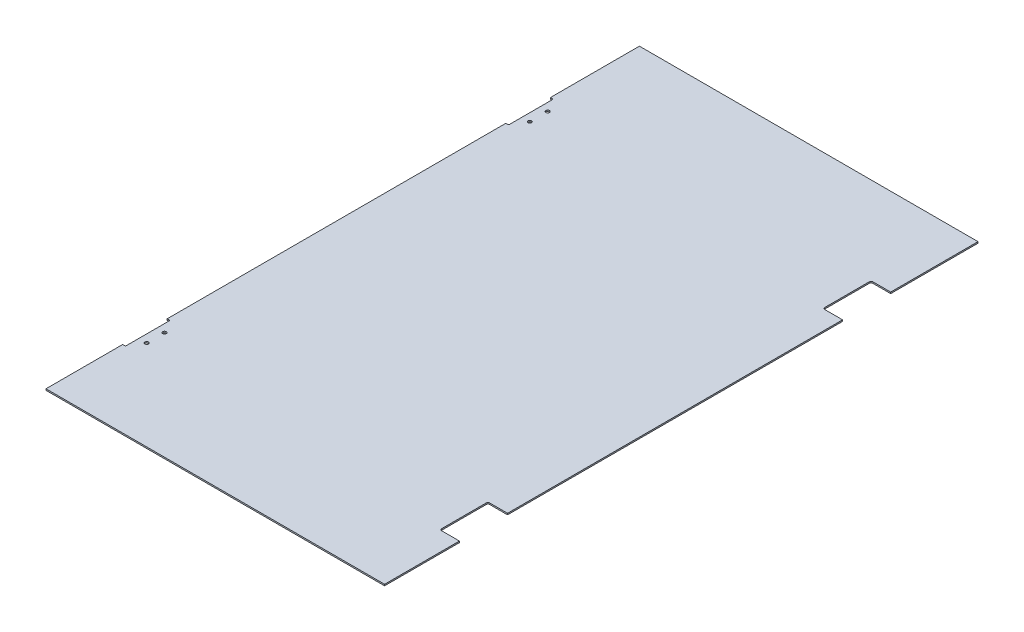
ISO-10303-21;
HEADER;
FILE_DESCRIPTION(('STEP AP214'),'2;1');
FILE_NAME('part.step','',(''),(''),'','','');
FILE_SCHEMA(('AUTOMOTIVE_DESIGN { 1 0 10303 214 1 1 1 1 }'));
ENDSEC;
DATA;
#1=APPLICATION_CONTEXT('core data for automotive mechanical design processes');
#2=APPLICATION_PROTOCOL_DEFINITION('international standard','automotive_design',2000,#1);
#3=PRODUCT_CONTEXT('',#1,'mechanical');
#4=PRODUCT('Part','Part','',(#3));
#5=PRODUCT_RELATED_PRODUCT_CATEGORY('part','',(#4));
#6=PRODUCT_DEFINITION_FORMATION('','',#4);
#7=PRODUCT_DEFINITION_CONTEXT('part definition',#1,'design');
#8=PRODUCT_DEFINITION('design','',#6,#7);
#9=PRODUCT_DEFINITION_SHAPE('','',#8);
#10=(LENGTH_UNIT() NAMED_UNIT(*) SI_UNIT(.MILLI.,.METRE.));
#11=(NAMED_UNIT(*) PLANE_ANGLE_UNIT() SI_UNIT($,.RADIAN.));
#12=(NAMED_UNIT(*) SI_UNIT($,.STERADIAN.) SOLID_ANGLE_UNIT());
#13=UNCERTAINTY_MEASURE_WITH_UNIT(LENGTH_MEASURE(1.E-05),#10,'distance_accuracy_value','');
#14=(GEOMETRIC_REPRESENTATION_CONTEXT(3) GLOBAL_UNCERTAINTY_ASSIGNED_CONTEXT((#13)) GLOBAL_UNIT_ASSIGNED_CONTEXT((#10,
#11,#12)) REPRESENTATION_CONTEXT('',''));
#15=CARTESIAN_POINT('',(0.,0.,0.));
#16=DIRECTION('',(0.,0.,1.));
#17=DIRECTION('',(1.,0.,0.));
#18=AXIS2_PLACEMENT_3D('',#15,#16,#17);
#19=CARTESIAN_POINT('',(95.3262518968133,0.79,-149.069802731411));
#20=DIRECTION('',(-1.,0.,0.));
#21=DIRECTION('',(0.,0.,1.));
#22=AXIS2_PLACEMENT_3D('',#19,#20,#21);
#23=PLANE('',#22);
#24=DIRECTION('',(0.,-1.,0.));
#25=VECTOR('',#24,1.);
#26=CARTESIAN_POINT('',(95.3262518968134,10.,114.930197268589));
#27=LINE('',#26,#25);
#28=CARTESIAN_POINT('',(95.3262518968134,0.790000000000001,114.930197268589));
#29=VERTEX_POINT('',#28);
#30=CARTESIAN_POINT('',(95.3262518968134,0.,114.930197268589));
#31=VERTEX_POINT('',#30);
#32=EDGE_CURVE('E251',#29,#31,#27,.T.);
#33=ORIENTED_EDGE('',*,*,#32,.T.);
#34=DIRECTION('',(0.,0.,-1.));
#35=VECTOR('',#34,1.);
#36=CARTESIAN_POINT('',(95.3262518968133,0.,-149.069802731411));
#37=LINE('',#36,#35);
#38=CARTESIAN_POINT('',(95.3262518968133,0.,-73.0698027314112));
#39=VERTEX_POINT('',#38);
#40=EDGE_CURVE('E439',#31,#39,#37,.T.);
#41=ORIENTED_EDGE('',*,*,#40,.T.);
#42=DIRECTION('',(0.,-1.,0.));
#43=VECTOR('',#42,1.);
#44=CARTESIAN_POINT('',(95.3262518968134,10.,-73.0698027314112));
#45=LINE('',#44,#43);
#46=CARTESIAN_POINT('',(95.3262518968134,0.790000000000001,-73.0698027314112));
#47=VERTEX_POINT('',#46);
#48=EDGE_CURVE('E339',#47,#39,#45,.T.);
#49=ORIENTED_EDGE('',*,*,#48,.F.);
#50=DIRECTION('',(0.,0.,-1.));
#51=VECTOR('',#50,1.);
#52=CARTESIAN_POINT('',(95.3262518968133,0.79,-149.069802731411));
#53=LINE('',#52,#51);
#54=EDGE_CURVE('E426',#29,#47,#53,.T.);
#55=ORIENTED_EDGE('',*,*,#54,.F.);
#56=EDGE_LOOP('',(#33,#41,#49,#55));
#57=FACE_BOUND('',#56,.T.);
#58=ADVANCED_FACE('F35',(#57),#23,.F.);
#59=DIRECTION('',(0.,-1.,0.));
#60=VECTOR('',#59,1.);
#61=CARTESIAN_POINT('',(95.3262518968134,10.,141.930197268589));
#62=LINE('',#61,#60);
#63=CARTESIAN_POINT('',(95.3262518968134,0.790000000000001,141.930197268589));
#64=VERTEX_POINT('',#63);
#65=CARTESIAN_POINT('',(95.3262518968134,0.,141.930197268589));
#66=VERTEX_POINT('',#65);
#67=EDGE_CURVE('E50',#64,#66,#62,.T.);
#68=ORIENTED_EDGE('',*,*,#67,.F.);
#69=CARTESIAN_POINT('',(95.3262518968134,0.79,183.930197268589));
#70=VERTEX_POINT('',#69);
#71=EDGE_CURVE('E422',#70,#64,#53,.T.);
#72=ORIENTED_EDGE('',*,*,#71,.F.);
#73=DIRECTION('',(0.,-1.,0.));
#74=VECTOR('',#73,1.);
#75=CARTESIAN_POINT('',(95.3262518968134,0.79,183.930197268589));
#76=LINE('',#75,#74);
#77=CARTESIAN_POINT('',(95.3262518968134,0.,183.930197268589));
#78=VERTEX_POINT('',#77);
#79=EDGE_CURVE('E43',#70,#78,#76,.T.);
#80=ORIENTED_EDGE('',*,*,#79,.T.);
#81=EDGE_CURVE('E436',#78,#66,#37,.T.);
#82=ORIENTED_EDGE('',*,*,#81,.T.);
#83=EDGE_LOOP('',(#68,#72,#80,#82));
#84=FACE_BOUND('',#83,.T.);
#85=ADVANCED_FACE('F449',(#84),#23,.F.);
#86=CARTESIAN_POINT('',(0.,0.79,0.));
#87=DIRECTION('',(0.,1.,0.));
#88=DIRECTION('',(0.,0.,1.));
#89=AXIS2_PLACEMENT_3D('',#86,#87,#88);
#90=PLANE('',#89);
#91=CARTESIAN_POINT('',(-88.6737481031867,0.790000000000001,133.430197268589));
#92=DIRECTION('',(0.,1.,0.));
#93=DIRECTION('',(0.,0.,1.));
#94=AXIS2_PLACEMENT_3D('',#91,#92,#93);
#95=CIRCLE('',#94,0.999999999999998);
#96=CARTESIAN_POINT('',(-88.6737481031867,0.790000000000001,134.430197268589));
#97=VERTEX_POINT('',#96);
#98=EDGE_CURVE('E307',#97,#97,#95,.F.);
#99=ORIENTED_EDGE('',*,*,#98,.T.);
#100=EDGE_LOOP('',(#99));
#101=FACE_BOUND('',#100,.T.);
#102=CARTESIAN_POINT('',(-88.6737481031867,0.790000000000001,123.430197268589));
#103=DIRECTION('',(0.,1.,0.));
#104=DIRECTION('',(0.,0.,1.));
#105=AXIS2_PLACEMENT_3D('',#102,#103,#104);
#106=CIRCLE('',#105,0.999999999999998);
#107=CARTESIAN_POINT('',(-88.6737481031867,0.790000000000001,124.430197268589));
#108=VERTEX_POINT('',#107);
#109=EDGE_CURVE('E291',#108,#108,#106,.F.);
#110=ORIENTED_EDGE('',*,*,#109,.T.);
#111=EDGE_LOOP('',(#110));
#112=FACE_BOUND('',#111,.T.);
#113=CARTESIAN_POINT('',(-88.6737481031867,0.790000000000001,-91.5698027314112));
#114=DIRECTION('',(0.,1.,0.));
#115=DIRECTION('',(0.,0.,1.));
#116=AXIS2_PLACEMENT_3D('',#113,#114,#115);
#117=CIRCLE('',#116,0.999999999999998);
#118=CARTESIAN_POINT('',(-88.6737481031867,0.790000000000001,-90.5698027314112));
#119=VERTEX_POINT('',#118);
#120=EDGE_CURVE('E400',#119,#119,#117,.T.);
#121=ORIENTED_EDGE('',*,*,#120,.F.);
#122=EDGE_LOOP('',(#121));
#123=FACE_BOUND('',#122,.T.);
#124=CARTESIAN_POINT('',(-88.6737481031867,0.790000000000001,-81.5698027314112));
#125=DIRECTION('',(0.,1.,0.));
#126=DIRECTION('',(0.,0.,1.));
#127=AXIS2_PLACEMENT_3D('',#124,#125,#126);
#128=CIRCLE('',#127,0.999999999999998);
#129=CARTESIAN_POINT('',(-88.6737481031867,0.790000000000001,-80.5698027314112));
#130=VERTEX_POINT('',#129);
#131=EDGE_CURVE('E384',#130,#130,#128,.T.);
#132=ORIENTED_EDGE('',*,*,#131,.F.);
#133=EDGE_LOOP('',(#132));
#134=FACE_BOUND('',#133,.T.);
#135=CARTESIAN_POINT('',(85.3262518968134,0.790000000000001,115.930197268589));
#136=DIRECTION('',(0.,1.,0.));
#137=DIRECTION('',(0.,0.,1.));
#138=AXIS2_PLACEMENT_3D('',#135,#136,#137);
#139=CIRCLE('',#138,1.);
#140=CARTESIAN_POINT('',(84.3262518968134,0.790000000000001,115.930197268589));
#141=VERTEX_POINT('',#140);
#142=CARTESIAN_POINT('',(85.3262518968134,0.790000000000001,114.930197268589));
#143=VERTEX_POINT('',#142);
#144=EDGE_CURVE('E266',#141,#143,#139,.F.);
#145=ORIENTED_EDGE('',*,*,#144,.T.);
#146=DIRECTION('',(1.,0.,0.));
#147=VECTOR('',#146,1.);
#148=CARTESIAN_POINT('',(0.,0.79,114.930197268589));
#149=LINE('',#148,#147);
#150=EDGE_CURVE('E269',#143,#29,#149,.T.);
#151=ORIENTED_EDGE('',*,*,#150,.T.);
#152=ORIENTED_EDGE('',*,*,#54,.T.);
#153=DIRECTION('',(1.,0.,0.));
#154=VECTOR('',#153,1.);
#155=CARTESIAN_POINT('',(0.,0.79,-73.0698027314112));
#156=LINE('',#155,#154);
#157=CARTESIAN_POINT('',(85.3262518968134,0.790000000000001,-73.0698027314112));
#158=VERTEX_POINT('',#157);
#159=EDGE_CURVE('E343',#158,#47,#156,.T.);
#160=ORIENTED_EDGE('',*,*,#159,.F.);
#161=CARTESIAN_POINT('',(85.3262518968134,0.790000000000001,-74.0698027314112));
#162=DIRECTION('',(0.,1.,0.));
#163=DIRECTION('',(0.,0.,1.));
#164=AXIS2_PLACEMENT_3D('',#161,#162,#163);
#165=CIRCLE('',#164,1.);
#166=CARTESIAN_POINT('',(84.3262518968134,0.790000000000001,-74.0698027314112));
#167=VERTEX_POINT('',#166);
#168=EDGE_CURVE('E356',#167,#158,#165,.T.);
#169=ORIENTED_EDGE('',*,*,#168,.F.);
#170=DIRECTION('',(0.,0.,1.));
#171=VECTOR('',#170,1.);
#172=CARTESIAN_POINT('',(84.3262518968134,0.79,0.));
#173=LINE('',#172,#171);
#174=CARTESIAN_POINT('',(84.3262518968134,0.790000000000001,-99.0698027314112));
#175=VERTEX_POINT('',#174);
#176=EDGE_CURVE('E358',#175,#167,#173,.T.);
#177=ORIENTED_EDGE('',*,*,#176,.F.);
#178=CARTESIAN_POINT('',(85.3262518968134,0.790000000000001,-99.0698027314112));
#179=DIRECTION('',(0.,1.,0.));
#180=DIRECTION('',(0.,0.,1.));
#181=AXIS2_PLACEMENT_3D('',#178,#179,#180);
#182=CIRCLE('',#181,1.);
#183=CARTESIAN_POINT('',(85.3262518968134,0.790000000000001,-100.069802731411));
#184=VERTEX_POINT('',#183);
#185=EDGE_CURVE('E360',#184,#175,#182,.T.);
#186=ORIENTED_EDGE('',*,*,#185,.F.);
#187=DIRECTION('',(-1.,0.,0.));
#188=VECTOR('',#187,1.);
#189=CARTESIAN_POINT('',(-1.38874748827638E-13,0.79,-100.069802731411));
#190=LINE('',#189,#188);
#191=CARTESIAN_POINT('',(95.3262518968134,0.790000000000001,-100.069802731411));
#192=VERTEX_POINT('',#191);
#193=EDGE_CURVE('E362',#192,#184,#190,.T.);
#194=ORIENTED_EDGE('',*,*,#193,.F.);
#195=CARTESIAN_POINT('',(95.3262518968133,0.79,-149.069802731411));
#196=VERTEX_POINT('',#195);
#197=EDGE_CURVE('E421',#192,#196,#53,.T.);
#198=ORIENTED_EDGE('',*,*,#197,.T.);
#199=DIRECTION('',(-1.,0.,0.));
#200=VECTOR('',#199,1.);
#201=CARTESIAN_POINT('',(65.3262518968133,0.79,-149.069802731411));
#202=LINE('',#201,#200);
#203=CARTESIAN_POINT('',(-94.6737481031867,0.79,-149.069802731411));
#204=VERTEX_POINT('',#203);
#205=EDGE_CURVE('E425',#196,#204,#202,.T.);
#206=ORIENTED_EDGE('',*,*,#205,.T.);
#207=DIRECTION('',(0.,0.,1.));
#208=VECTOR('',#207,1.);
#209=CARTESIAN_POINT('',(-94.6737481031867,0.79,-149.069802731411));
#210=LINE('',#209,#208);
#211=CARTESIAN_POINT('',(-94.6737481031867,0.790000000000001,-99.0698027314112));
#212=VERTEX_POINT('',#211);
#213=EDGE_CURVE('E414',#204,#212,#210,.T.);
#214=ORIENTED_EDGE('',*,*,#213,.T.);
#215=DIRECTION('',(-1.,0.,0.));
#216=VECTOR('',#215,1.);
#217=CARTESIAN_POINT('',(0.,0.79,-99.0698027314112));
#218=LINE('',#217,#216);
#219=CARTESIAN_POINT('',(-93.5937481031867,0.790000000000001,-99.0698027314112));
#220=VERTEX_POINT('',#219);
#221=EDGE_CURVE('E403',#220,#212,#218,.T.);
#222=ORIENTED_EDGE('',*,*,#221,.F.);
#223=CARTESIAN_POINT('',(-93.5937481031867,0.790000000000001,-98.5698027314112));
#224=DIRECTION('',(0.,1.,0.));
#225=DIRECTION('',(0.,0.,1.));
#226=AXIS2_PLACEMENT_3D('',#223,#224,#225);
#227=CIRCLE('',#226,0.5);
#228=CARTESIAN_POINT('',(-93.0937481031867,0.790000000000001,-98.5698027314112));
#229=VERTEX_POINT('',#228);
#230=EDGE_CURVE('E405',#229,#220,#227,.T.);
#231=ORIENTED_EDGE('',*,*,#230,.F.);
#232=DIRECTION('',(0.,0.,-1.));
#233=VECTOR('',#232,1.);
#234=CARTESIAN_POINT('',(-93.0937481031867,0.79,0.));
#235=LINE('',#234,#233);
#236=CARTESIAN_POINT('',(-93.0937481031867,0.790000000000001,-74.5698027314112));
#237=VERTEX_POINT('',#236);
#238=EDGE_CURVE('E407',#237,#229,#235,.T.);
#239=ORIENTED_EDGE('',*,*,#238,.F.);
#240=CARTESIAN_POINT('',(-93.5937481031867,0.790000000000001,-74.5698027314112));
#241=DIRECTION('',(0.,1.,0.));
#242=DIRECTION('',(0.,0.,1.));
#243=AXIS2_PLACEMENT_3D('',#240,#241,#242);
#244=CIRCLE('',#243,0.5);
#245=CARTESIAN_POINT('',(-93.5937481031867,0.790000000000001,-74.0698027314112));
#246=VERTEX_POINT('',#245);
#247=EDGE_CURVE('E409',#246,#237,#244,.T.);
#248=ORIENTED_EDGE('',*,*,#247,.F.);
#249=DIRECTION('',(1.,0.,0.));
#250=VECTOR('',#249,1.);
#251=CARTESIAN_POINT('',(0.,0.79,-74.0698027314112));
#252=LINE('',#251,#250);
#253=CARTESIAN_POINT('',(-94.6737481031867,0.790000000000001,-74.0698027314112));
#254=VERTEX_POINT('',#253);
#255=EDGE_CURVE('E411',#254,#246,#252,.T.);
#256=ORIENTED_EDGE('',*,*,#255,.F.);
#257=CARTESIAN_POINT('',(-94.6737481031867,0.790000000000001,115.930197268589));
#258=VERTEX_POINT('',#257);
#259=EDGE_CURVE('E418',#254,#258,#210,.T.);
#260=ORIENTED_EDGE('',*,*,#259,.T.);
#261=DIRECTION('',(1.,0.,0.));
#262=VECTOR('',#261,1.);
#263=CARTESIAN_POINT('',(0.,0.79,115.930197268589));
#264=LINE('',#263,#262);
#265=CARTESIAN_POINT('',(-93.5937481031867,0.790000000000001,115.930197268589));
#266=VERTEX_POINT('',#265);
#267=EDGE_CURVE('E310',#258,#266,#264,.T.);
#268=ORIENTED_EDGE('',*,*,#267,.T.);
#269=CARTESIAN_POINT('',(-93.5937481031867,0.790000000000001,116.430197268589));
#270=DIRECTION('',(0.,1.,0.));
#271=DIRECTION('',(0.,0.,1.));
#272=AXIS2_PLACEMENT_3D('',#269,#270,#271);
#273=CIRCLE('',#272,0.5);
#274=CARTESIAN_POINT('',(-93.0937481031867,0.790000000000001,116.430197268589));
#275=VERTEX_POINT('',#274);
#276=EDGE_CURVE('E313',#266,#275,#273,.F.);
#277=ORIENTED_EDGE('',*,*,#276,.T.);
#278=DIRECTION('',(0.,0.,1.));
#279=VECTOR('',#278,1.);
#280=CARTESIAN_POINT('',(-93.0937481031867,0.79,0.));
#281=LINE('',#280,#279);
#282=CARTESIAN_POINT('',(-93.0937481031867,0.790000000000001,140.430197268589));
#283=VERTEX_POINT('',#282);
#284=EDGE_CURVE('E316',#275,#283,#281,.T.);
#285=ORIENTED_EDGE('',*,*,#284,.T.);
#286=CARTESIAN_POINT('',(-93.5937481031867,0.790000000000001,140.430197268589));
#287=DIRECTION('',(0.,1.,0.));
#288=DIRECTION('',(0.,0.,1.));
#289=AXIS2_PLACEMENT_3D('',#286,#287,#288);
#290=CIRCLE('',#289,0.5);
#291=CARTESIAN_POINT('',(-93.5937481031867,0.790000000000001,140.930197268589));
#292=VERTEX_POINT('',#291);
#293=EDGE_CURVE('E319',#283,#292,#290,.F.);
#294=ORIENTED_EDGE('',*,*,#293,.T.);
#295=DIRECTION('',(-1.,0.,0.));
#296=VECTOR('',#295,1.);
#297=CARTESIAN_POINT('',(0.,0.79,140.930197268589));
#298=LINE('',#297,#296);
#299=CARTESIAN_POINT('',(-94.6737481031867,0.790000000000001,140.930197268589));
#300=VERTEX_POINT('',#299);
#301=EDGE_CURVE('E322',#292,#300,#298,.T.);
#302=ORIENTED_EDGE('',*,*,#301,.T.);
#303=CARTESIAN_POINT('',(-94.6737481031866,0.79,183.930197268589));
#304=VERTEX_POINT('',#303);
#305=EDGE_CURVE('E419',#300,#304,#210,.T.);
#306=ORIENTED_EDGE('',*,*,#305,.T.);
#307=DIRECTION('',(1.,0.,0.));
#308=VECTOR('',#307,1.);
#309=CARTESIAN_POINT('',(-94.6737481031866,0.79,183.930197268589));
#310=LINE('',#309,#308);
#311=EDGE_CURVE('E417',#304,#70,#310,.T.);
#312=ORIENTED_EDGE('',*,*,#311,.T.);
#313=ORIENTED_EDGE('',*,*,#71,.T.);
#314=DIRECTION('',(-1.,0.,0.));
#315=VECTOR('',#314,1.);
#316=CARTESIAN_POINT('',(-1.96967716121472E-13,0.79,141.930197268589));
#317=LINE('',#316,#315);
#318=CARTESIAN_POINT('',(85.3262518968134,0.790000000000001,141.930197268589));
#319=VERTEX_POINT('',#318);
#320=EDGE_CURVE('E254',#64,#319,#317,.T.);
#321=ORIENTED_EDGE('',*,*,#320,.T.);
#322=CARTESIAN_POINT('',(85.3262518968134,0.790000000000001,140.930197268589));
#323=DIRECTION('',(0.,1.,0.));
#324=DIRECTION('',(0.,0.,1.));
#325=AXIS2_PLACEMENT_3D('',#322,#323,#324);
#326=CIRCLE('',#325,1.);
#327=CARTESIAN_POINT('',(84.3262518968134,0.790000000000001,140.930197268589));
#328=VERTEX_POINT('',#327);
#329=EDGE_CURVE('E229',#319,#328,#326,.F.);
#330=ORIENTED_EDGE('',*,*,#329,.T.);
#331=DIRECTION('',(0.,0.,-1.));
#332=VECTOR('',#331,1.);
#333=CARTESIAN_POINT('',(84.3262518968134,0.79,0.));
#334=LINE('',#333,#332);
#335=EDGE_CURVE('E263',#328,#141,#334,.T.);
#336=ORIENTED_EDGE('',*,*,#335,.T.);
#337=EDGE_LOOP('',(#145,#151,#152,#160,#169,#177,#186,#194,#198,#206,#214,#222,#231,#239,#248,
#256,#260,#268,#277,#285,#294,#302,#306,#312,#313,#321,#330,#336));
#338=FACE_BOUND('',#337,.T.);
#339=ADVANCED_FACE('F472',(#101,#112,#123,#134,#338),#90,.T.);
#340=CARTESIAN_POINT('',(0.,0.,0.));
#341=DIRECTION('',(0.,1.,0.));
#342=DIRECTION('',(0.,0.,1.));
#343=AXIS2_PLACEMENT_3D('',#340,#341,#342);
#344=PLANE('',#343);
#345=CARTESIAN_POINT('',(-88.6737481031867,0.,-81.5698027314112));
#346=DIRECTION('',(0.,-1.,0.));
#347=DIRECTION('',(0.,0.,-1.));
#348=AXIS2_PLACEMENT_3D('',#345,#346,#347);
#349=CIRCLE('',#348,0.999999999999998);
#350=CARTESIAN_POINT('',(-88.6737481031867,0.,-82.5698027314112));
#351=VERTEX_POINT('',#350);
#352=EDGE_CURVE('E364',#351,#351,#349,.T.);
#353=ORIENTED_EDGE('',*,*,#352,.F.);
#354=EDGE_LOOP('',(#353));
#355=FACE_BOUND('',#354,.T.);
#356=CARTESIAN_POINT('',(-88.6737481031867,0.,-91.5698027314112));
#357=DIRECTION('',(0.,-1.,0.));
#358=DIRECTION('',(0.,0.,-1.));
#359=AXIS2_PLACEMENT_3D('',#356,#357,#358);
#360=CIRCLE('',#359,0.999999999999998);
#361=CARTESIAN_POINT('',(-88.6737481031867,0.,-92.5698027314112));
#362=VERTEX_POINT('',#361);
#363=EDGE_CURVE('E369',#362,#362,#360,.T.);
#364=ORIENTED_EDGE('',*,*,#363,.F.);
#365=EDGE_LOOP('',(#364));
#366=FACE_BOUND('',#365,.T.);
#367=CARTESIAN_POINT('',(-88.6737481031867,0.,123.430197268589));
#368=DIRECTION('',(0.,1.,0.));
#369=DIRECTION('',(0.,0.,1.));
#370=AXIS2_PLACEMENT_3D('',#367,#368,#369);
#371=CIRCLE('',#370,0.999999999999998);
#372=CARTESIAN_POINT('',(-88.6737481031867,0.,124.430197268589));
#373=VERTEX_POINT('',#372);
#374=EDGE_CURVE('E272',#373,#373,#371,.T.);
#375=ORIENTED_EDGE('',*,*,#374,.T.);
#376=EDGE_LOOP('',(#375));
#377=FACE_BOUND('',#376,.T.);
#378=CARTESIAN_POINT('',(-88.6737481031867,0.,133.430197268589));
#379=DIRECTION('',(0.,1.,0.));
#380=DIRECTION('',(0.,0.,1.));
#381=AXIS2_PLACEMENT_3D('',#378,#379,#380);
#382=CIRCLE('',#381,0.999999999999998);
#383=CARTESIAN_POINT('',(-88.6737481031867,0.,134.430197268589));
#384=VERTEX_POINT('',#383);
#385=EDGE_CURVE('E276',#384,#384,#382,.T.);
#386=ORIENTED_EDGE('',*,*,#385,.T.);
#387=EDGE_LOOP('',(#386));
#388=FACE_BOUND('',#387,.T.);
#389=DIRECTION('',(-1.,0.,0.));
#390=VECTOR('',#389,1.);
#391=CARTESIAN_POINT('',(95.3262518968134,0.,114.930197268589));
#392=LINE('',#391,#390);
#393=CARTESIAN_POINT('',(85.3262518968134,0.,114.930197268589));
#394=VERTEX_POINT('',#393);
#395=EDGE_CURVE('E249',#31,#394,#392,.T.);
#396=ORIENTED_EDGE('',*,*,#395,.T.);
#397=CARTESIAN_POINT('',(85.3262518968134,0.,115.930197268589));
#398=DIRECTION('',(0.,1.,0.));
#399=DIRECTION('',(0.,0.,1.));
#400=AXIS2_PLACEMENT_3D('',#397,#398,#399);
#401=CIRCLE('',#400,1.);
#402=CARTESIAN_POINT('',(84.3262518968134,0.,115.930197268589));
#403=VERTEX_POINT('',#402);
#404=EDGE_CURVE('E245',#394,#403,#401,.T.);
#405=ORIENTED_EDGE('',*,*,#404,.T.);
#406=DIRECTION('',(0.,0.,1.));
#407=VECTOR('',#406,1.);
#408=CARTESIAN_POINT('',(84.3262518968134,0.,140.930197268589));
#409=LINE('',#408,#407);
#410=CARTESIAN_POINT('',(84.3262518968134,0.,140.930197268589));
#411=VERTEX_POINT('',#410);
#412=EDGE_CURVE('E243',#403,#411,#409,.T.);
#413=ORIENTED_EDGE('',*,*,#412,.T.);
#414=CARTESIAN_POINT('',(85.3262518968134,0.,140.930197268589));
#415=DIRECTION('',(0.,1.,0.));
#416=DIRECTION('',(0.,0.,1.));
#417=AXIS2_PLACEMENT_3D('',#414,#415,#416);
#418=CIRCLE('',#417,1.);
#419=CARTESIAN_POINT('',(85.3262518968134,0.,141.930197268589));
#420=VERTEX_POINT('',#419);
#421=EDGE_CURVE('E226',#411,#420,#418,.T.);
#422=ORIENTED_EDGE('',*,*,#421,.T.);
#423=DIRECTION('',(1.,0.,0.));
#424=VECTOR('',#423,1.);
#425=CARTESIAN_POINT('',(95.3262518968134,0.,141.930197268589));
#426=LINE('',#425,#424);
#427=EDGE_CURVE('E233',#420,#66,#426,.T.);
#428=ORIENTED_EDGE('',*,*,#427,.T.);
#429=ORIENTED_EDGE('',*,*,#81,.F.);
#430=DIRECTION('',(1.,0.,0.));
#431=VECTOR('',#430,1.);
#432=CARTESIAN_POINT('',(-94.6737481031866,0.,183.930197268589));
#433=LINE('',#432,#431);
#434=CARTESIAN_POINT('',(-94.6737481031866,0.,183.930197268589));
#435=VERTEX_POINT('',#434);
#436=EDGE_CURVE('E432',#435,#78,#433,.T.);
#437=ORIENTED_EDGE('',*,*,#436,.F.);
#438=DIRECTION('',(0.,0.,1.));
#439=VECTOR('',#438,1.);
#440=CARTESIAN_POINT('',(-94.6737481031867,0.,-149.069802731411));
#441=LINE('',#440,#439);
#442=CARTESIAN_POINT('',(-94.6737481031867,0.,140.930197268589));
#443=VERTEX_POINT('',#442);
#444=EDGE_CURVE('E413',#443,#435,#441,.T.);
#445=ORIENTED_EDGE('',*,*,#444,.F.);
#446=DIRECTION('',(1.,0.,0.));
#447=VECTOR('',#446,1.);
#448=CARTESIAN_POINT('',(-94.6737481031867,0.,140.930197268589));
#449=LINE('',#448,#447);
#450=CARTESIAN_POINT('',(-93.5937481031867,0.,140.930197268589));
#451=VERTEX_POINT('',#450);
#452=EDGE_CURVE('E285',#443,#451,#449,.T.);
#453=ORIENTED_EDGE('',*,*,#452,.T.);
#454=CARTESIAN_POINT('',(-93.5937481031867,0.,140.430197268589));
#455=DIRECTION('',(0.,1.,0.));
#456=DIRECTION('',(0.,0.,-1.));
#457=AXIS2_PLACEMENT_3D('',#454,#455,#456);
#458=CIRCLE('',#457,0.5);
#459=CARTESIAN_POINT('',(-93.0937481031867,0.,140.430197268589));
#460=VERTEX_POINT('',#459);
#461=EDGE_CURVE('E282',#451,#460,#458,.T.);
#462=ORIENTED_EDGE('',*,*,#461,.T.);
#463=DIRECTION('',(0.,0.,-1.));
#464=VECTOR('',#463,1.);
#465=CARTESIAN_POINT('',(-93.0937481031867,0.,140.430197268589));
#466=LINE('',#465,#464);
#467=CARTESIAN_POINT('',(-93.0937481031867,0.,116.430197268589));
#468=VERTEX_POINT('',#467);
#469=EDGE_CURVE('E279',#460,#468,#466,.T.);
#470=ORIENTED_EDGE('',*,*,#469,.T.);
#471=CARTESIAN_POINT('',(-93.5937481031867,0.,116.430197268589));
#472=DIRECTION('',(0.,1.,0.));
#473=DIRECTION('',(0.,0.,1.));
#474=AXIS2_PLACEMENT_3D('',#471,#472,#473);
#475=CIRCLE('',#474,0.5);
#476=CARTESIAN_POINT('',(-93.5937481031867,0.,115.930197268589));
#477=VERTEX_POINT('',#476);
#478=EDGE_CURVE('E275',#468,#477,#475,.T.);
#479=ORIENTED_EDGE('',*,*,#478,.T.);
#480=DIRECTION('',(-1.,0.,0.));
#481=VECTOR('',#480,1.);
#482=CARTESIAN_POINT('',(-94.6737481031867,0.,115.930197268589));
#483=LINE('',#482,#481);
#484=CARTESIAN_POINT('',(-94.6737481031866,0.,115.930197268589));
#485=VERTEX_POINT('',#484);
#486=EDGE_CURVE('E273',#477,#485,#483,.T.);
#487=ORIENTED_EDGE('',*,*,#486,.T.);
#488=CARTESIAN_POINT('',(-94.6737481031867,0.,-74.0698027314112));
#489=VERTEX_POINT('',#488);
#490=EDGE_CURVE('E433',#489,#485,#441,.T.);
#491=ORIENTED_EDGE('',*,*,#490,.F.);
#492=DIRECTION('',(-1.,0.,0.));
#493=VECTOR('',#492,1.);
#494=CARTESIAN_POINT('',(-94.6737481031867,0.,-74.0698027314112));
#495=LINE('',#494,#493);
#496=CARTESIAN_POINT('',(-93.5937481031867,0.,-74.0698027314112));
#497=VERTEX_POINT('',#496);
#498=EDGE_CURVE('E378',#497,#489,#495,.T.);
#499=ORIENTED_EDGE('',*,*,#498,.F.);
#500=CARTESIAN_POINT('',(-93.5937481031867,0.,-74.5698027314112));
#501=DIRECTION('',(0.,-1.,0.));
#502=DIRECTION('',(0.,0.,-1.));
#503=AXIS2_PLACEMENT_3D('',#500,#501,#502);
#504=CIRCLE('',#503,0.5);
#505=CARTESIAN_POINT('',(-93.0937481031867,0.,-74.5698027314112));
#506=VERTEX_POINT('',#505);
#507=EDGE_CURVE('E375',#506,#497,#504,.T.);
#508=ORIENTED_EDGE('',*,*,#507,.F.);
#509=DIRECTION('',(0.,0.,1.));
#510=VECTOR('',#509,1.);
#511=CARTESIAN_POINT('',(-93.0937481031867,0.,-98.5698027314112));
#512=LINE('',#511,#510);
#513=CARTESIAN_POINT('',(-93.0937481031867,0.,-98.5698027314112));
#514=VERTEX_POINT('',#513);
#515=EDGE_CURVE('E372',#514,#506,#512,.T.);
#516=ORIENTED_EDGE('',*,*,#515,.F.);
#517=CARTESIAN_POINT('',(-93.5937481031867,0.,-98.5698027314112));
#518=DIRECTION('',(0.,-1.,0.));
#519=DIRECTION('',(0.,0.,1.));
#520=AXIS2_PLACEMENT_3D('',#517,#518,#519);
#521=CIRCLE('',#520,0.5);
#522=CARTESIAN_POINT('',(-93.5937481031867,0.,-99.0698027314112));
#523=VERTEX_POINT('',#522);
#524=EDGE_CURVE('E368',#523,#514,#521,.T.);
#525=ORIENTED_EDGE('',*,*,#524,.F.);
#526=DIRECTION('',(1.,0.,0.));
#527=VECTOR('',#526,1.);
#528=CARTESIAN_POINT('',(-94.6737481031867,0.,-99.0698027314112));
#529=LINE('',#528,#527);
#530=CARTESIAN_POINT('',(-94.6737481031867,0.,-99.0698027314112));
#531=VERTEX_POINT('',#530);
#532=EDGE_CURVE('E365',#531,#523,#529,.T.);
#533=ORIENTED_EDGE('',*,*,#532,.F.);
#534=CARTESIAN_POINT('',(-94.6737481031867,0.,-149.069802731411));
#535=VERTEX_POINT('',#534);
#536=EDGE_CURVE('E429',#535,#531,#441,.T.);
#537=ORIENTED_EDGE('',*,*,#536,.F.);
#538=DIRECTION('',(-1.,0.,0.));
#539=VECTOR('',#538,1.);
#540=CARTESIAN_POINT('',(-94.6737481031867,0.,-149.069802731411));
#541=LINE('',#540,#539);
#542=CARTESIAN_POINT('',(95.3262518968133,0.,-149.069802731411));
#543=VERTEX_POINT('',#542);
#544=EDGE_CURVE('E438',#543,#535,#541,.T.);
#545=ORIENTED_EDGE('',*,*,#544,.F.);
#546=CARTESIAN_POINT('',(95.3262518968134,0.,-100.069802731411));
#547=VERTEX_POINT('',#546);
#548=EDGE_CURVE('E435',#547,#543,#37,.T.);
#549=ORIENTED_EDGE('',*,*,#548,.F.);
#550=DIRECTION('',(1.,0.,0.));
#551=VECTOR('',#550,1.);
#552=CARTESIAN_POINT('',(95.3262518968134,0.,-100.069802731411));
#553=LINE('',#552,#551);
#554=CARTESIAN_POINT('',(85.3262518968134,0.,-100.069802731411));
#555=VERTEX_POINT('',#554);
#556=EDGE_CURVE('E337',#555,#547,#553,.T.);
#557=ORIENTED_EDGE('',*,*,#556,.F.);
#558=CARTESIAN_POINT('',(85.3262518968134,0.,-99.0698027314112));
#559=DIRECTION('',(0.,-1.,0.));
#560=DIRECTION('',(0.,0.,-1.));
#561=AXIS2_PLACEMENT_3D('',#558,#559,#560);
#562=CIRCLE('',#561,1.);
#563=CARTESIAN_POINT('',(84.3262518968134,0.,-99.0698027314112));
#564=VERTEX_POINT('',#563);
#565=EDGE_CURVE('E334',#564,#555,#562,.T.);
#566=ORIENTED_EDGE('',*,*,#565,.F.);
#567=DIRECTION('',(0.,0.,-1.));
#568=VECTOR('',#567,1.);
#569=CARTESIAN_POINT('',(84.3262518968134,0.,-99.0698027314112));
#570=LINE('',#569,#568);
#571=CARTESIAN_POINT('',(84.3262518968134,0.,-74.0698027314112));
#572=VERTEX_POINT('',#571);
#573=EDGE_CURVE('E331',#572,#564,#570,.T.);
#574=ORIENTED_EDGE('',*,*,#573,.F.);
#575=CARTESIAN_POINT('',(85.3262518968134,0.,-74.0698027314112));
#576=DIRECTION('',(0.,-1.,0.));
#577=DIRECTION('',(0.,0.,-1.));
#578=AXIS2_PLACEMENT_3D('',#575,#576,#577);
#579=CIRCLE('',#578,1.);
#580=CARTESIAN_POINT('',(85.3262518968134,0.,-73.0698027314112));
#581=VERTEX_POINT('',#580);
#582=EDGE_CURVE('E328',#581,#572,#579,.T.);
#583=ORIENTED_EDGE('',*,*,#582,.F.);
#584=DIRECTION('',(-1.,0.,0.));
#585=VECTOR('',#584,1.);
#586=CARTESIAN_POINT('',(95.3262518968134,0.,-73.0698027314112));
#587=LINE('',#586,#585);
#588=EDGE_CURVE('E325',#39,#581,#587,.T.);
#589=ORIENTED_EDGE('',*,*,#588,.F.);
#590=ORIENTED_EDGE('',*,*,#40,.F.);
#591=EDGE_LOOP('',(#396,#405,#413,#422,#428,#429,#437,#445,#453,#462,#470,#479,#487,#491,#499,
#508,#516,#525,#533,#537,#545,#549,#557,#566,#574,#583,#589,#590));
#592=FACE_BOUND('',#591,.T.);
#593=ADVANCED_FACE('F240',(#355,#366,#377,#388,#592),#344,.F.);
#594=CARTESIAN_POINT('',(-94.6737481031867,0.79,-149.069802731411));
#595=DIRECTION('',(1.,0.,0.));
#596=DIRECTION('',(0.,0.,-1.));
#597=AXIS2_PLACEMENT_3D('',#594,#595,#596);
#598=PLANE('',#597);
#599=DIRECTION('',(0.,-1.,0.));
#600=VECTOR('',#599,1.);
#601=CARTESIAN_POINT('',(-94.6737481031867,10.,140.930197268589));
#602=LINE('',#601,#600);
#603=EDGE_CURVE('E288',#300,#443,#602,.T.);
#604=ORIENTED_EDGE('',*,*,#603,.T.);
#605=ORIENTED_EDGE('',*,*,#444,.T.);
#606=DIRECTION('',(0.,-1.,0.));
#607=VECTOR('',#606,1.);
#608=CARTESIAN_POINT('',(-94.6737481031866,0.79,183.930197268589));
#609=LINE('',#608,#607);
#610=EDGE_CURVE('E11',#304,#435,#609,.T.);
#611=ORIENTED_EDGE('',*,*,#610,.F.);
#612=ORIENTED_EDGE('',*,*,#305,.F.);
#613=EDGE_LOOP('',(#604,#605,#611,#612));
#614=FACE_BOUND('',#613,.T.);
#615=ADVANCED_FACE('F458',(#614),#598,.F.);
#616=DIRECTION('',(0.,-1.,0.));
#617=VECTOR('',#616,1.);
#618=CARTESIAN_POINT('',(-94.6737481031867,10.,115.930197268589));
#619=LINE('',#618,#617);
#620=EDGE_CURVE('E58',#258,#485,#619,.T.);
#621=ORIENTED_EDGE('',*,*,#620,.F.);
#622=ORIENTED_EDGE('',*,*,#259,.F.);
#623=DIRECTION('',(0.,-1.,0.));
#624=VECTOR('',#623,1.);
#625=CARTESIAN_POINT('',(-94.6737481031867,10.,-74.0698027314112));
#626=LINE('',#625,#624);
#627=EDGE_CURVE('E381',#254,#489,#626,.T.);
#628=ORIENTED_EDGE('',*,*,#627,.T.);
#629=ORIENTED_EDGE('',*,*,#490,.T.);
#630=EDGE_LOOP('',(#621,#622,#628,#629));
#631=FACE_BOUND('',#630,.T.);
#632=ADVANCED_FACE('F462',(#631),#598,.F.);
#633=ORIENTED_EDGE('',*,*,#197,.F.);
#634=DIRECTION('',(0.,-1.,0.));
#635=VECTOR('',#634,1.);
#636=CARTESIAN_POINT('',(95.3262518968134,10.,-100.069802731411));
#637=LINE('',#636,#635);
#638=EDGE_CURVE('E340',#192,#547,#637,.T.);
#639=ORIENTED_EDGE('',*,*,#638,.T.);
#640=ORIENTED_EDGE('',*,*,#548,.T.);
#641=DIRECTION('',(0.,-1.,0.));
#642=VECTOR('',#641,1.);
#643=CARTESIAN_POINT('',(95.3262518968133,0.79,-149.069802731411));
#644=LINE('',#643,#642);
#645=EDGE_CURVE('E443',#196,#543,#644,.T.);
#646=ORIENTED_EDGE('',*,*,#645,.F.);
#647=EDGE_LOOP('',(#633,#639,#640,#646));
#648=FACE_BOUND('',#647,.T.);
#649=ADVANCED_FACE('F499',(#648),#23,.F.);
#650=ORIENTED_EDGE('',*,*,#536,.T.);
#651=DIRECTION('',(0.,-1.,0.));
#652=VECTOR('',#651,1.);
#653=CARTESIAN_POINT('',(-94.6737481031867,10.,-99.0698027314112));
#654=LINE('',#653,#652);
#655=EDGE_CURVE('E380',#212,#531,#654,.T.);
#656=ORIENTED_EDGE('',*,*,#655,.F.);
#657=ORIENTED_EDGE('',*,*,#213,.F.);
#658=DIRECTION('',(0.,-1.,0.));
#659=VECTOR('',#658,1.);
#660=CARTESIAN_POINT('',(-94.6737481031867,0.79,-149.069802731411));
#661=LINE('',#660,#659);
#662=EDGE_CURVE('E428',#204,#535,#661,.T.);
#663=ORIENTED_EDGE('',*,*,#662,.T.);
#664=EDGE_LOOP('',(#650,#656,#657,#663));
#665=FACE_BOUND('',#664,.T.);
#666=ADVANCED_FACE('F37',(#665),#598,.F.);
#667=CARTESIAN_POINT('',(-94.6737481031866,0.79,183.930197268589));
#668=DIRECTION('',(0.,0.,-1.));
#669=DIRECTION('',(-1.,0.,0.));
#670=AXIS2_PLACEMENT_3D('',#667,#668,#669);
#671=PLANE('',#670);
#672=ORIENTED_EDGE('',*,*,#436,.T.);
#673=ORIENTED_EDGE('',*,*,#79,.F.);
#674=ORIENTED_EDGE('',*,*,#311,.F.);
#675=ORIENTED_EDGE('',*,*,#610,.T.);
#676=EDGE_LOOP('',(#672,#673,#674,#675));
#677=FACE_BOUND('',#676,.T.);
#678=ADVANCED_FACE('F455',(#677),#671,.F.);
#679=CARTESIAN_POINT('',(-94.6737481031867,0.79,-149.069802731411));
#680=DIRECTION('',(0.,0.,1.));
#681=DIRECTION('',(1.,0.,0.));
#682=AXIS2_PLACEMENT_3D('',#679,#680,#681);
#683=PLANE('',#682);
#684=ORIENTED_EDGE('',*,*,#544,.T.);
#685=ORIENTED_EDGE('',*,*,#662,.F.);
#686=ORIENTED_EDGE('',*,*,#205,.F.);
#687=ORIENTED_EDGE('',*,*,#645,.T.);
#688=EDGE_LOOP('',(#684,#685,#686,#687));
#689=FACE_BOUND('',#688,.T.);
#690=ADVANCED_FACE('F531',(#689),#683,.F.);
#691=CARTESIAN_POINT('',(-88.6737481031867,10.,-81.5698027314112));
#692=DIRECTION('',(0.,-1.,0.));
#693=DIRECTION('',(0.,0.,-1.));
#694=AXIS2_PLACEMENT_3D('',#691,#692,#693);
#695=CYLINDRICAL_SURFACE('',#694,0.999999999999998);
#696=ORIENTED_EDGE('',*,*,#131,.T.);
#697=EDGE_LOOP('',(#696));
#698=FACE_BOUND('',#697,.T.);
#699=ORIENTED_EDGE('',*,*,#352,.T.);
#700=EDGE_LOOP('',(#699));
#701=FACE_BOUND('',#700,.T.);
#702=ADVANCED_FACE('F561',(#698,#701),#695,.F.);
#703=CARTESIAN_POINT('',(-88.6737481031867,10.,-91.5698027314112));
#704=DIRECTION('',(0.,-1.,0.));
#705=DIRECTION('',(0.,0.,-1.));
#706=AXIS2_PLACEMENT_3D('',#703,#704,#705);
#707=CYLINDRICAL_SURFACE('',#706,0.999999999999998);
#708=ORIENTED_EDGE('',*,*,#120,.T.);
#709=EDGE_LOOP('',(#708));
#710=FACE_BOUND('',#709,.T.);
#711=ORIENTED_EDGE('',*,*,#363,.T.);
#712=EDGE_LOOP('',(#711));
#713=FACE_BOUND('',#712,.T.);
#714=ADVANCED_FACE('F554',(#710,#713),#707,.F.);
#715=CARTESIAN_POINT('',(-94.6737481031867,10.,-74.0698027314112));
#716=DIRECTION('',(0.,0.,1.));
#717=DIRECTION('',(1.,0.,0.));
#718=AXIS2_PLACEMENT_3D('',#715,#716,#717);
#719=PLANE('',#718);
#720=ORIENTED_EDGE('',*,*,#255,.T.);
#721=DIRECTION('',(0.,-1.,0.));
#722=VECTOR('',#721,1.);
#723=CARTESIAN_POINT('',(-93.5937481031867,10.,-74.0698027314112));
#724=LINE('',#723,#722);
#725=EDGE_CURVE('E385',#246,#497,#724,.T.);
#726=ORIENTED_EDGE('',*,*,#725,.T.);
#727=ORIENTED_EDGE('',*,*,#498,.T.);
#728=ORIENTED_EDGE('',*,*,#627,.F.);
#729=EDGE_LOOP('',(#720,#726,#727,#728));
#730=FACE_BOUND('',#729,.T.);
#731=ADVANCED_FACE('F552',(#730),#719,.F.);
#732=CARTESIAN_POINT('',(-93.5937481031867,10.,-74.5698027314112));
#733=DIRECTION('',(0.,-1.,0.));
#734=DIRECTION('',(0.,0.,-1.));
#735=AXIS2_PLACEMENT_3D('',#732,#733,#734);
#736=CYLINDRICAL_SURFACE('',#735,0.5);
#737=ORIENTED_EDGE('',*,*,#247,.T.);
#738=DIRECTION('',(0.,-1.,0.));
#739=VECTOR('',#738,1.);
#740=CARTESIAN_POINT('',(-93.0937481031867,10.,-74.5698027314112));
#741=LINE('',#740,#739);
#742=EDGE_CURVE('E387',#237,#506,#741,.T.);
#743=ORIENTED_EDGE('',*,*,#742,.T.);
#744=ORIENTED_EDGE('',*,*,#507,.T.);
#745=ORIENTED_EDGE('',*,*,#725,.F.);
#746=EDGE_LOOP('',(#737,#743,#744,#745));
#747=FACE_BOUND('',#746,.T.);
#748=ADVANCED_FACE('F549',(#747),#736,.F.);
#749=CARTESIAN_POINT('',(-93.0937481031867,10.,-98.5698027314112));
#750=DIRECTION('',(1.,0.,0.));
#751=DIRECTION('',(0.,0.,-1.));
#752=AXIS2_PLACEMENT_3D('',#749,#750,#751);
#753=PLANE('',#752);
#754=ORIENTED_EDGE('',*,*,#238,.T.);
#755=DIRECTION('',(0.,-1.,0.));
#756=VECTOR('',#755,1.);
#757=CARTESIAN_POINT('',(-93.0937481031867,10.,-98.5698027314112));
#758=LINE('',#757,#756);
#759=EDGE_CURVE('E389',#229,#514,#758,.T.);
#760=ORIENTED_EDGE('',*,*,#759,.T.);
#761=ORIENTED_EDGE('',*,*,#515,.T.);
#762=ORIENTED_EDGE('',*,*,#742,.F.);
#763=EDGE_LOOP('',(#754,#760,#761,#762));
#764=FACE_BOUND('',#763,.T.);
#765=ADVANCED_FACE('F547',(#764),#753,.F.);
#766=CARTESIAN_POINT('',(-93.5937481031867,10.,-98.5698027314112));
#767=DIRECTION('',(0.,-1.,0.));
#768=DIRECTION('',(0.,0.,-1.));
#769=AXIS2_PLACEMENT_3D('',#766,#767,#768);
#770=CYLINDRICAL_SURFACE('',#769,0.5);
#771=ORIENTED_EDGE('',*,*,#230,.T.);
#772=DIRECTION('',(0.,-1.,0.));
#773=VECTOR('',#772,1.);
#774=CARTESIAN_POINT('',(-93.5937481031867,10.,-99.0698027314112));
#775=LINE('',#774,#773);
#776=EDGE_CURVE('E391',#220,#523,#775,.T.);
#777=ORIENTED_EDGE('',*,*,#776,.T.);
#778=ORIENTED_EDGE('',*,*,#524,.T.);
#779=ORIENTED_EDGE('',*,*,#759,.F.);
#780=EDGE_LOOP('',(#771,#777,#778,#779));
#781=FACE_BOUND('',#780,.T.);
#782=ADVANCED_FACE('F543',(#781),#770,.F.);
#783=CARTESIAN_POINT('',(-94.6737481031867,10.,-99.0698027314112));
#784=DIRECTION('',(0.,0.,-1.));
#785=DIRECTION('',(-1.,0.,0.));
#786=AXIS2_PLACEMENT_3D('',#783,#784,#785);
#787=PLANE('',#786);
#788=ORIENTED_EDGE('',*,*,#221,.T.);
#789=ORIENTED_EDGE('',*,*,#655,.T.);
#790=ORIENTED_EDGE('',*,*,#532,.T.);
#791=ORIENTED_EDGE('',*,*,#776,.F.);
#792=EDGE_LOOP('',(#788,#789,#790,#791));
#793=FACE_BOUND('',#792,.T.);
#794=ADVANCED_FACE('F537',(#793),#787,.F.);
#795=CARTESIAN_POINT('',(95.3262518968134,10.,-100.069802731411));
#796=DIRECTION('',(0.,0.,-1.));
#797=DIRECTION('',(-1.,0.,0.));
#798=AXIS2_PLACEMENT_3D('',#795,#796,#797);
#799=PLANE('',#798);
#800=ORIENTED_EDGE('',*,*,#193,.T.);
#801=DIRECTION('',(0.,-1.,0.));
#802=VECTOR('',#801,1.);
#803=CARTESIAN_POINT('',(85.3262518968134,10.,-100.069802731411));
#804=LINE('',#803,#802);
#805=EDGE_CURVE('E344',#184,#555,#804,.T.);
#806=ORIENTED_EDGE('',*,*,#805,.T.);
#807=ORIENTED_EDGE('',*,*,#556,.T.);
#808=ORIENTED_EDGE('',*,*,#638,.F.);
#809=EDGE_LOOP('',(#800,#806,#807,#808));
#810=FACE_BOUND('',#809,.T.);
#811=ADVANCED_FACE('F572',(#810),#799,.F.);
#812=CARTESIAN_POINT('',(85.3262518968134,10.,-99.0698027314112));
#813=DIRECTION('',(0.,-1.,0.));
#814=DIRECTION('',(0.,0.,-1.));
#815=AXIS2_PLACEMENT_3D('',#812,#813,#814);
#816=CYLINDRICAL_SURFACE('',#815,1.);
#817=ORIENTED_EDGE('',*,*,#185,.T.);
#818=DIRECTION('',(0.,-1.,0.));
#819=VECTOR('',#818,1.);
#820=CARTESIAN_POINT('',(84.3262518968134,10.,-99.0698027314112));
#821=LINE('',#820,#819);
#822=EDGE_CURVE('E346',#175,#564,#821,.T.);
#823=ORIENTED_EDGE('',*,*,#822,.T.);
#824=ORIENTED_EDGE('',*,*,#565,.T.);
#825=ORIENTED_EDGE('',*,*,#805,.F.);
#826=EDGE_LOOP('',(#817,#823,#824,#825));
#827=FACE_BOUND('',#826,.T.);
#828=ADVANCED_FACE('F647',(#827),#816,.F.);
#829=CARTESIAN_POINT('',(84.3262518968134,10.,-99.0698027314112));
#830=DIRECTION('',(-1.,0.,0.));
#831=DIRECTION('',(0.,0.,1.));
#832=AXIS2_PLACEMENT_3D('',#829,#830,#831);
#833=PLANE('',#832);
#834=ORIENTED_EDGE('',*,*,#176,.T.);
#835=DIRECTION('',(0.,-1.,0.));
#836=VECTOR('',#835,1.);
#837=CARTESIAN_POINT('',(84.3262518968134,10.,-74.0698027314112));
#838=LINE('',#837,#836);
#839=EDGE_CURVE('E348',#167,#572,#838,.T.);
#840=ORIENTED_EDGE('',*,*,#839,.T.);
#841=ORIENTED_EDGE('',*,*,#573,.T.);
#842=ORIENTED_EDGE('',*,*,#822,.F.);
#843=EDGE_LOOP('',(#834,#840,#841,#842));
#844=FACE_BOUND('',#843,.T.);
#845=ADVANCED_FACE('F657',(#844),#833,.F.);
#846=CARTESIAN_POINT('',(85.3262518968134,10.,-74.0698027314112));
#847=DIRECTION('',(0.,-1.,0.));
#848=DIRECTION('',(0.,0.,-1.));
#849=AXIS2_PLACEMENT_3D('',#846,#847,#848);
#850=CYLINDRICAL_SURFACE('',#849,1.);
#851=ORIENTED_EDGE('',*,*,#168,.T.);
#852=DIRECTION('',(0.,-1.,0.));
#853=VECTOR('',#852,1.);
#854=CARTESIAN_POINT('',(85.3262518968134,10.,-73.0698027314112));
#855=LINE('',#854,#853);
#856=EDGE_CURVE('E350',#158,#581,#855,.T.);
#857=ORIENTED_EDGE('',*,*,#856,.T.);
#858=ORIENTED_EDGE('',*,*,#582,.T.);
#859=ORIENTED_EDGE('',*,*,#839,.F.);
#860=EDGE_LOOP('',(#851,#857,#858,#859));
#861=FACE_BOUND('',#860,.T.);
#862=ADVANCED_FACE('F667',(#861),#850,.F.);
#863=CARTESIAN_POINT('',(95.3262518968134,10.,-73.0698027314112));
#864=DIRECTION('',(0.,0.,1.));
#865=DIRECTION('',(1.,0.,0.));
#866=AXIS2_PLACEMENT_3D('',#863,#864,#865);
#867=PLANE('',#866);
#868=ORIENTED_EDGE('',*,*,#159,.T.);
#869=ORIENTED_EDGE('',*,*,#48,.T.);
#870=ORIENTED_EDGE('',*,*,#588,.T.);
#871=ORIENTED_EDGE('',*,*,#856,.F.);
#872=EDGE_LOOP('',(#868,#869,#870,#871));
#873=FACE_BOUND('',#872,.T.);
#874=ADVANCED_FACE('F522',(#873),#867,.F.);
#875=CARTESIAN_POINT('',(-88.6737481031867,10.,123.430197268589));
#876=DIRECTION('',(0.,-1.,0.));
#877=DIRECTION('',(0.,0.,-1.));
#878=AXIS2_PLACEMENT_3D('',#875,#876,#877);
#879=CYLINDRICAL_SURFACE('',#878,0.999999999999998);
#880=ORIENTED_EDGE('',*,*,#109,.F.);
#881=EDGE_LOOP('',(#880));
#882=FACE_BOUND('',#881,.T.);
#883=ORIENTED_EDGE('',*,*,#374,.F.);
#884=EDGE_LOOP('',(#883));
#885=FACE_BOUND('',#884,.T.);
#886=ADVANCED_FACE('F684',(#882,#885),#879,.F.);
#887=CARTESIAN_POINT('',(-88.6737481031867,10.,133.430197268589));
#888=DIRECTION('',(0.,-1.,0.));
#889=DIRECTION('',(0.,0.,-1.));
#890=AXIS2_PLACEMENT_3D('',#887,#888,#889);
#891=CYLINDRICAL_SURFACE('',#890,0.999999999999998);
#892=ORIENTED_EDGE('',*,*,#98,.F.);
#893=EDGE_LOOP('',(#892));
#894=FACE_BOUND('',#893,.T.);
#895=ORIENTED_EDGE('',*,*,#385,.F.);
#896=EDGE_LOOP('',(#895));
#897=FACE_BOUND('',#896,.T.);
#898=ADVANCED_FACE('F732',(#894,#897),#891,.F.);
#899=CARTESIAN_POINT('',(-94.6737481031867,10.,140.930197268589));
#900=DIRECTION('',(0.,0.,-1.));
#901=DIRECTION('',(-1.,0.,0.));
#902=AXIS2_PLACEMENT_3D('',#899,#900,#901);
#903=PLANE('',#902);
#904=DIRECTION('',(0.,-1.,0.));
#905=VECTOR('',#904,1.);
#906=CARTESIAN_POINT('',(-93.5937481031867,10.,140.930197268589));
#907=LINE('',#906,#905);
#908=EDGE_CURVE('E292',#292,#451,#907,.T.);
#909=ORIENTED_EDGE('',*,*,#908,.T.);
#910=ORIENTED_EDGE('',*,*,#452,.F.);
#911=ORIENTED_EDGE('',*,*,#603,.F.);
#912=ORIENTED_EDGE('',*,*,#301,.F.);
#913=EDGE_LOOP('',(#909,#910,#911,#912));
#914=FACE_BOUND('',#913,.T.);
#915=ADVANCED_FACE('F477',(#914),#903,.T.);
#916=CARTESIAN_POINT('',(-93.5937481031867,10.,140.430197268589));
#917=DIRECTION('',(0.,-1.,0.));
#918=DIRECTION('',(0.,0.,-1.));
#919=AXIS2_PLACEMENT_3D('',#916,#917,#918);
#920=CYLINDRICAL_SURFACE('',#919,0.5);
#921=DIRECTION('',(0.,-1.,0.));
#922=VECTOR('',#921,1.);
#923=CARTESIAN_POINT('',(-93.0937481031867,10.,140.430197268589));
#924=LINE('',#923,#922);
#925=EDGE_CURVE('E294',#283,#460,#924,.T.);
#926=ORIENTED_EDGE('',*,*,#925,.T.);
#927=ORIENTED_EDGE('',*,*,#461,.F.);
#928=ORIENTED_EDGE('',*,*,#908,.F.);
#929=ORIENTED_EDGE('',*,*,#293,.F.);
#930=EDGE_LOOP('',(#926,#927,#928,#929));
#931=FACE_BOUND('',#930,.T.);
#932=ADVANCED_FACE('F480',(#931),#920,.F.);
#933=CARTESIAN_POINT('',(-93.0937481031867,10.,140.430197268589));
#934=DIRECTION('',(-1.,0.,0.));
#935=DIRECTION('',(0.,0.,1.));
#936=AXIS2_PLACEMENT_3D('',#933,#934,#935);
#937=PLANE('',#936);
#938=DIRECTION('',(0.,-1.,0.));
#939=VECTOR('',#938,1.);
#940=CARTESIAN_POINT('',(-93.0937481031867,10.,116.430197268589));
#941=LINE('',#940,#939);
#942=EDGE_CURVE('E296',#275,#468,#941,.T.);
#943=ORIENTED_EDGE('',*,*,#942,.T.);
#944=ORIENTED_EDGE('',*,*,#469,.F.);
#945=ORIENTED_EDGE('',*,*,#925,.F.);
#946=ORIENTED_EDGE('',*,*,#284,.F.);
#947=EDGE_LOOP('',(#943,#944,#945,#946));
#948=FACE_BOUND('',#947,.T.);
#949=ADVANCED_FACE('F484',(#948),#937,.T.);
#950=CARTESIAN_POINT('',(-93.5937481031867,10.,116.430197268589));
#951=DIRECTION('',(0.,-1.,0.));
#952=DIRECTION('',(0.,0.,-1.));
#953=AXIS2_PLACEMENT_3D('',#950,#951,#952);
#954=CYLINDRICAL_SURFACE('',#953,0.5);
#955=DIRECTION('',(0.,-1.,0.));
#956=VECTOR('',#955,1.);
#957=CARTESIAN_POINT('',(-93.5937481031867,10.,115.930197268589));
#958=LINE('',#957,#956);
#959=EDGE_CURVE('E298',#266,#477,#958,.T.);
#960=ORIENTED_EDGE('',*,*,#959,.T.);
#961=ORIENTED_EDGE('',*,*,#478,.F.);
#962=ORIENTED_EDGE('',*,*,#942,.F.);
#963=ORIENTED_EDGE('',*,*,#276,.F.);
#964=EDGE_LOOP('',(#960,#961,#962,#963));
#965=FACE_BOUND('',#964,.T.);
#966=ADVANCED_FACE('F486',(#965),#954,.F.);
#967=CARTESIAN_POINT('',(-94.6737481031867,10.,115.930197268589));
#968=DIRECTION('',(0.,0.,1.));
#969=DIRECTION('',(1.,0.,0.));
#970=AXIS2_PLACEMENT_3D('',#967,#968,#969);
#971=PLANE('',#970);
#972=ORIENTED_EDGE('',*,*,#620,.T.);
#973=ORIENTED_EDGE('',*,*,#486,.F.);
#974=ORIENTED_EDGE('',*,*,#959,.F.);
#975=ORIENTED_EDGE('',*,*,#267,.F.);
#976=EDGE_LOOP('',(#972,#973,#974,#975));
#977=FACE_BOUND('',#976,.T.);
#978=ADVANCED_FACE('F469',(#977),#971,.T.);
#979=CARTESIAN_POINT('',(95.3262518968134,10.,114.930197268589));
#980=DIRECTION('',(0.,0.,1.));
#981=DIRECTION('',(1.,0.,0.));
#982=AXIS2_PLACEMENT_3D('',#979,#980,#981);
#983=PLANE('',#982);
#984=DIRECTION('',(0.,-1.,0.));
#985=VECTOR('',#984,1.);
#986=CARTESIAN_POINT('',(85.3262518968134,10.,114.930197268589));
#987=LINE('',#986,#985);
#988=EDGE_CURVE('E255',#143,#394,#987,.T.);
#989=ORIENTED_EDGE('',*,*,#988,.T.);
#990=ORIENTED_EDGE('',*,*,#395,.F.);
#991=ORIENTED_EDGE('',*,*,#32,.F.);
#992=ORIENTED_EDGE('',*,*,#150,.F.);
#993=EDGE_LOOP('',(#989,#990,#991,#992));
#994=FACE_BOUND('',#993,.T.);
#995=ADVANCED_FACE('F493',(#994),#983,.T.);
#996=CARTESIAN_POINT('',(85.3262518968134,10.,115.930197268589));
#997=DIRECTION('',(0.,-1.,0.));
#998=DIRECTION('',(0.,0.,-1.));
#999=AXIS2_PLACEMENT_3D('',#996,#997,#998);
#1000=CYLINDRICAL_SURFACE('',#999,1.);
#1001=DIRECTION('',(0.,-1.,0.));
#1002=VECTOR('',#1001,1.);
#1003=CARTESIAN_POINT('',(84.3262518968134,10.,115.930197268589));
#1004=LINE('',#1003,#1002);
#1005=EDGE_CURVE('E257',#141,#403,#1004,.T.);
#1006=ORIENTED_EDGE('',*,*,#1005,.T.);
#1007=ORIENTED_EDGE('',*,*,#404,.F.);
#1008=ORIENTED_EDGE('',*,*,#988,.F.);
#1009=ORIENTED_EDGE('',*,*,#144,.F.);
#1010=EDGE_LOOP('',(#1006,#1007,#1008,#1009));
#1011=FACE_BOUND('',#1010,.T.);
#1012=ADVANCED_FACE('F781',(#1011),#1000,.F.);
#1013=CARTESIAN_POINT('',(84.3262518968134,10.,140.930197268589));
#1014=DIRECTION('',(1.,0.,0.));
#1015=DIRECTION('',(0.,0.,-1.));
#1016=AXIS2_PLACEMENT_3D('',#1013,#1014,#1015);
#1017=PLANE('',#1016);
#1018=DIRECTION('',(0.,-1.,0.));
#1019=VECTOR('',#1018,1.);
#1020=CARTESIAN_POINT('',(84.3262518968134,10.,140.930197268589));
#1021=LINE('',#1020,#1019);
#1022=EDGE_CURVE('E231',#328,#411,#1021,.T.);
#1023=ORIENTED_EDGE('',*,*,#1022,.T.);
#1024=ORIENTED_EDGE('',*,*,#412,.F.);
#1025=ORIENTED_EDGE('',*,*,#1005,.F.);
#1026=ORIENTED_EDGE('',*,*,#335,.F.);
#1027=EDGE_LOOP('',(#1023,#1024,#1025,#1026));
#1028=FACE_BOUND('',#1027,.T.);
#1029=ADVANCED_FACE('F791',(#1028),#1017,.T.);
#1030=CARTESIAN_POINT('',(85.3262518968134,10.,140.930197268589));
#1031=DIRECTION('',(0.,-1.,0.));
#1032=DIRECTION('',(0.,0.,-1.));
#1033=AXIS2_PLACEMENT_3D('',#1030,#1031,#1032);
#1034=CYLINDRICAL_SURFACE('',#1033,1.);
#1035=DIRECTION('',(0.,-1.,0.));
#1036=VECTOR('',#1035,1.);
#1037=CARTESIAN_POINT('',(85.3262518968134,10.,141.930197268589));
#1038=LINE('',#1037,#1036);
#1039=EDGE_CURVE('E222',#319,#420,#1038,.T.);
#1040=ORIENTED_EDGE('',*,*,#1039,.T.);
#1041=ORIENTED_EDGE('',*,*,#421,.F.);
#1042=ORIENTED_EDGE('',*,*,#1022,.F.);
#1043=ORIENTED_EDGE('',*,*,#329,.F.);
#1044=EDGE_LOOP('',(#1040,#1041,#1042,#1043));
#1045=FACE_BOUND('',#1044,.T.);
#1046=ADVANCED_FACE('F223',(#1045),#1034,.F.);
#1047=CARTESIAN_POINT('',(95.3262518968134,10.,141.930197268589));
#1048=DIRECTION('',(0.,0.,-1.));
#1049=DIRECTION('',(-1.,0.,0.));
#1050=AXIS2_PLACEMENT_3D('',#1047,#1048,#1049);
#1051=PLANE('',#1050);
#1052=ORIENTED_EDGE('',*,*,#67,.T.);
#1053=ORIENTED_EDGE('',*,*,#427,.F.);
#1054=ORIENTED_EDGE('',*,*,#1039,.F.);
#1055=ORIENTED_EDGE('',*,*,#320,.F.);
#1056=EDGE_LOOP('',(#1052,#1053,#1054,#1055));
#1057=FACE_BOUND('',#1056,.T.);
#1058=ADVANCED_FACE('F234',(#1057),#1051,.T.);
#1059=CLOSED_SHELL('',(#58,#85,#339,#593,#615,#632,#649,#666,#678,#690,#702,#714,#731,#748,#765,
#782,#794,#811,#828,#845,#862,#874,#886,#898,#915,#932,#949,#966,#978,#995,#1012,#1029,#1046,#1058));
#1060=MANIFOLD_SOLID_BREP('B2',#1059);
#1061=ADVANCED_BREP_SHAPE_REPRESENTATION('',(#18,#1060),#14);
#1062=SHAPE_DEFINITION_REPRESENTATION(#9,#1061);
ENDSEC;
END-ISO-10303-21;
